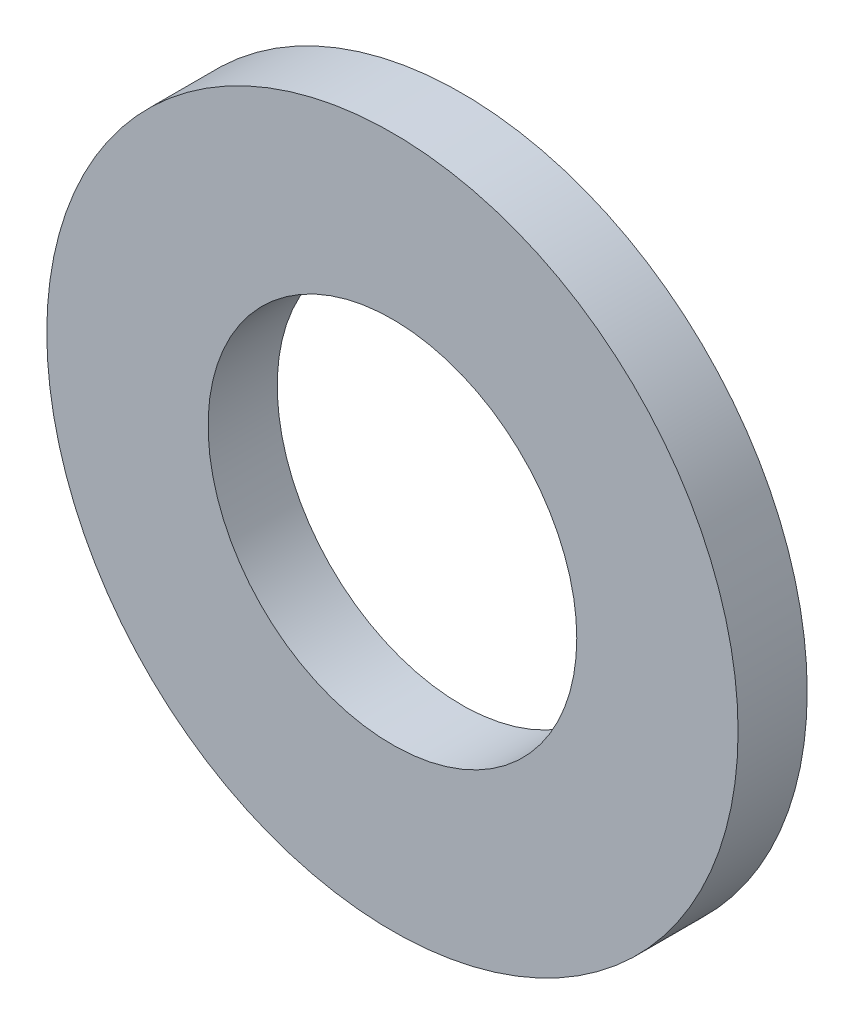
ISO-10303-21;
HEADER;
FILE_DESCRIPTION(('STEP AP214'),'2;1');
FILE_NAME('part.step','',(''),(''),'','','');
FILE_SCHEMA(('AUTOMOTIVE_DESIGN { 1 0 10303 214 1 1 1 1 }'));
ENDSEC;
DATA;
#1=APPLICATION_CONTEXT('core data for automotive mechanical design processes');
#2=APPLICATION_PROTOCOL_DEFINITION('international standard','automotive_design',2000,#1);
#3=PRODUCT_CONTEXT('',#1,'mechanical');
#4=PRODUCT('Part','Part','',(#3));
#5=PRODUCT_RELATED_PRODUCT_CATEGORY('part','',(#4));
#6=PRODUCT_DEFINITION_FORMATION('','',#4);
#7=PRODUCT_DEFINITION_CONTEXT('part definition',#1,'design');
#8=PRODUCT_DEFINITION('design','',#6,#7);
#9=PRODUCT_DEFINITION_SHAPE('','',#8);
#10=(LENGTH_UNIT() NAMED_UNIT(*) SI_UNIT(.MILLI.,.METRE.));
#11=(NAMED_UNIT(*) PLANE_ANGLE_UNIT() SI_UNIT($,.RADIAN.));
#12=(NAMED_UNIT(*) SI_UNIT($,.STERADIAN.) SOLID_ANGLE_UNIT());
#13=UNCERTAINTY_MEASURE_WITH_UNIT(LENGTH_MEASURE(1.E-05),#10,'distance_accuracy_value','');
#14=(GEOMETRIC_REPRESENTATION_CONTEXT(3) GLOBAL_UNCERTAINTY_ASSIGNED_CONTEXT((#13)) GLOBAL_UNIT_ASSIGNED_CONTEXT((#10,
#11,#12)) REPRESENTATION_CONTEXT('',''));
#15=CARTESIAN_POINT('',(0.,0.,0.));
#16=DIRECTION('',(0.,0.,1.));
#17=DIRECTION('',(1.,0.,0.));
#18=AXIS2_PLACEMENT_3D('',#15,#16,#17);
#19=CARTESIAN_POINT('',(0.,0.,0.299999999999999));
#20=DIRECTION('',(0.,0.,1.));
#21=DIRECTION('',(1.,0.,0.));
#22=AXIS2_PLACEMENT_3D('',#19,#20,#21);
#23=PLANE('',#22);
#24=CARTESIAN_POINT('',(0.,0.,0.299999999999999));
#25=DIRECTION('',(0.,0.,1.));
#26=DIRECTION('',(1.,0.,0.));
#27=AXIS2_PLACEMENT_3D('',#24,#25,#26);
#28=CIRCLE('',#27,3.);
#29=CARTESIAN_POINT('',(3.,0.,0.299999999999999));
#30=VERTEX_POINT('',#29);
#31=EDGE_CURVE('E10',#30,#30,#28,.T.);
#32=ORIENTED_EDGE('',*,*,#31,.T.);
#33=EDGE_LOOP('',(#32));
#34=FACE_BOUND('',#33,.T.);
#35=CARTESIAN_POINT('',(0.,0.,0.299999999999999));
#36=DIRECTION('',(0.,0.,1.));
#37=DIRECTION('',(1.,0.,0.));
#38=AXIS2_PLACEMENT_3D('',#35,#36,#37);
#39=CIRCLE('',#38,1.6);
#40=CARTESIAN_POINT('',(1.6,0.,0.299999999999999));
#41=VERTEX_POINT('',#40);
#42=EDGE_CURVE('E40',#41,#41,#39,.T.);
#43=ORIENTED_EDGE('',*,*,#42,.F.);
#44=EDGE_LOOP('',(#43));
#45=FACE_BOUND('',#44,.T.);
#46=ADVANCED_FACE('F33',(#34,#45),#23,.T.);
#47=CARTESIAN_POINT('',(0.,0.,0.299999999999999));
#48=DIRECTION('',(0.,0.,-1.));
#49=DIRECTION('',(-1.,0.,0.));
#50=AXIS2_PLACEMENT_3D('',#47,#48,#49);
#51=CYLINDRICAL_SURFACE('',#50,3.);
#52=ORIENTED_EDGE('',*,*,#31,.F.);
#53=EDGE_LOOP('',(#52));
#54=FACE_BOUND('',#53,.T.);
#55=CARTESIAN_POINT('',(0.,0.,-0.300000000000001));
#56=DIRECTION('',(0.,0.,1.));
#57=DIRECTION('',(1.,0.,0.));
#58=AXIS2_PLACEMENT_3D('',#55,#56,#57);
#59=CIRCLE('',#58,3.);
#60=CARTESIAN_POINT('',(3.,0.,-0.300000000000001));
#61=VERTEX_POINT('',#60);
#62=EDGE_CURVE('E44',#61,#61,#59,.T.);
#63=ORIENTED_EDGE('',*,*,#62,.T.);
#64=EDGE_LOOP('',(#63));
#65=FACE_BOUND('',#64,.T.);
#66=ADVANCED_FACE('F35',(#54,#65),#51,.T.);
#67=CARTESIAN_POINT('',(0.,0.,0.299999999999999));
#68=DIRECTION('',(0.,0.,-1.));
#69=DIRECTION('',(-1.,0.,0.));
#70=AXIS2_PLACEMENT_3D('',#67,#68,#69);
#71=CYLINDRICAL_SURFACE('',#70,1.6);
#72=ORIENTED_EDGE('',*,*,#42,.T.);
#73=EDGE_LOOP('',(#72));
#74=FACE_BOUND('',#73,.T.);
#75=CARTESIAN_POINT('',(0.,0.,-0.300000000000001));
#76=DIRECTION('',(0.,0.,1.));
#77=DIRECTION('',(1.,0.,0.));
#78=AXIS2_PLACEMENT_3D('',#75,#76,#77);
#79=CIRCLE('',#78,1.6);
#80=CARTESIAN_POINT('',(1.6,0.,-0.300000000000001));
#81=VERTEX_POINT('',#80);
#82=EDGE_CURVE('E48',#81,#81,#79,.T.);
#83=ORIENTED_EDGE('',*,*,#82,.F.);
#84=EDGE_LOOP('',(#83));
#85=FACE_BOUND('',#84,.T.);
#86=ADVANCED_FACE('F57',(#74,#85),#71,.F.);
#87=CARTESIAN_POINT('',(0.,0.,-0.300000000000001));
#88=DIRECTION('',(0.,0.,1.));
#89=DIRECTION('',(1.,0.,0.));
#90=AXIS2_PLACEMENT_3D('',#87,#88,#89);
#91=PLANE('',#90);
#92=ORIENTED_EDGE('',*,*,#82,.T.);
#93=EDGE_LOOP('',(#92));
#94=FACE_BOUND('',#93,.T.);
#95=ORIENTED_EDGE('',*,*,#62,.F.);
#96=EDGE_LOOP('',(#95));
#97=FACE_BOUND('',#96,.T.);
#98=ADVANCED_FACE('F54',(#94,#97),#91,.F.);
#99=CLOSED_SHELL('',(#46,#66,#86,#98));
#100=MANIFOLD_SOLID_BREP('B2',#99);
#101=ADVANCED_BREP_SHAPE_REPRESENTATION('',(#18,#100),#14);
#102=SHAPE_DEFINITION_REPRESENTATION(#9,#101);
ENDSEC;
END-ISO-10303-21;
